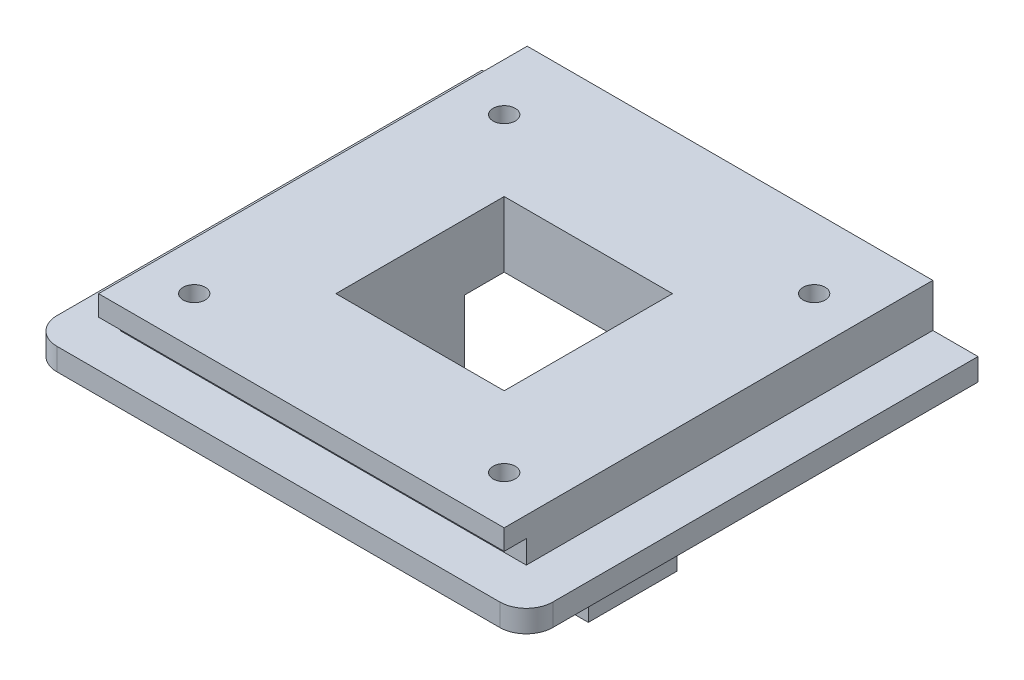
ISO-10303-21;
HEADER;
FILE_DESCRIPTION(('STEP AP214'),'2;1');
FILE_NAME('part.step','',(''),(''),'','','');
FILE_SCHEMA(('AUTOMOTIVE_DESIGN { 1 0 10303 214 1 1 1 1 }'));
ENDSEC;
DATA;
#1=APPLICATION_CONTEXT('core data for automotive mechanical design processes');
#2=APPLICATION_PROTOCOL_DEFINITION('international standard','automotive_design',2000,#1);
#3=PRODUCT_CONTEXT('',#1,'mechanical');
#4=PRODUCT('Part','Part','',(#3));
#5=PRODUCT_RELATED_PRODUCT_CATEGORY('part','',(#4));
#6=PRODUCT_DEFINITION_FORMATION('','',#4);
#7=PRODUCT_DEFINITION_CONTEXT('part definition',#1,'design');
#8=PRODUCT_DEFINITION('design','',#6,#7);
#9=PRODUCT_DEFINITION_SHAPE('','',#8);
#10=(LENGTH_UNIT() NAMED_UNIT(*) SI_UNIT(.MILLI.,.METRE.));
#11=(NAMED_UNIT(*) PLANE_ANGLE_UNIT() SI_UNIT($,.RADIAN.));
#12=(NAMED_UNIT(*) SI_UNIT($,.STERADIAN.) SOLID_ANGLE_UNIT());
#13=UNCERTAINTY_MEASURE_WITH_UNIT(LENGTH_MEASURE(1.E-05),#10,'distance_accuracy_value','');
#14=(GEOMETRIC_REPRESENTATION_CONTEXT(3) GLOBAL_UNCERTAINTY_ASSIGNED_CONTEXT((#13)) GLOBAL_UNIT_ASSIGNED_CONTEXT((#10,
#11,#12)) REPRESENTATION_CONTEXT('',''));
#15=CARTESIAN_POINT('',(0.,0.,0.));
#16=DIRECTION('',(0.,0.,1.));
#17=DIRECTION('',(1.,0.,0.));
#18=AXIS2_PLACEMENT_3D('',#15,#16,#17);
#19=CARTESIAN_POINT('',(32.5,-17.5,-15.5));
#20=DIRECTION('',(1.,0.,0.));
#21=DIRECTION('',(0.,0.,-1.));
#22=AXIS2_PLACEMENT_3D('',#19,#20,#21);
#23=PLANE('',#22);
#24=DIRECTION('',(0.,1.,0.));
#25=VECTOR('',#24,1.);
#26=CARTESIAN_POINT('',(32.5,-17.5,-15.5));
#27=LINE('',#26,#25);
#28=CARTESIAN_POINT('',(32.5,-17.5,-15.5));
#29=VERTEX_POINT('',#28);
#30=CARTESIAN_POINT('',(32.5,-2.5,-15.5));
#31=VERTEX_POINT('',#30);
#32=EDGE_CURVE('E320',#29,#31,#27,.T.);
#33=ORIENTED_EDGE('',*,*,#32,.T.);
#34=DIRECTION('',(0.,0.,1.));
#35=VECTOR('',#34,1.);
#36=CARTESIAN_POINT('',(32.5,-2.5,-11.));
#37=LINE('',#36,#35);
#38=CARTESIAN_POINT('',(32.5,-2.5,-11.));
#39=VERTEX_POINT('',#38);
#40=EDGE_CURVE('E499',#31,#39,#37,.T.);
#41=ORIENTED_EDGE('',*,*,#40,.T.);
#42=DIRECTION('',(0.,-1.,0.));
#43=VECTOR('',#42,1.);
#44=CARTESIAN_POINT('',(32.5,5.,-11.));
#45=LINE('',#44,#43);
#46=CARTESIAN_POINT('',(32.5,4.9,-11.));
#47=VERTEX_POINT('',#46);
#48=EDGE_CURVE('E254',#47,#39,#45,.T.);
#49=ORIENTED_EDGE('',*,*,#48,.F.);
#50=DIRECTION('',(0.,0.,1.));
#51=VECTOR('',#50,1.);
#52=CARTESIAN_POINT('',(32.5,4.9,-15.5));
#53=LINE('',#52,#51);
#54=CARTESIAN_POINT('',(32.5,4.9,-30.));
#55=VERTEX_POINT('',#54);
#56=EDGE_CURVE('E231',#55,#47,#53,.T.);
#57=ORIENTED_EDGE('',*,*,#56,.F.);
#58=DIRECTION('',(0.,-1.,0.));
#59=VECTOR('',#58,1.);
#60=CARTESIAN_POINT('',(32.5,5.,-30.));
#61=LINE('',#60,#59);
#62=CARTESIAN_POINT('',(32.5,-2.5,-30.));
#63=VERTEX_POINT('',#62);
#64=EDGE_CURVE('E247',#55,#63,#61,.T.);
#65=ORIENTED_EDGE('',*,*,#64,.T.);
#66=CARTESIAN_POINT('',(32.5,-2.5,-25.5));
#67=VERTEX_POINT('',#66);
#68=EDGE_CURVE('E496',#63,#67,#37,.T.);
#69=ORIENTED_EDGE('',*,*,#68,.T.);
#70=DIRECTION('',(0.,1.,0.));
#71=VECTOR('',#70,1.);
#72=CARTESIAN_POINT('',(32.5,-17.5,-25.5));
#73=LINE('',#72,#71);
#74=CARTESIAN_POINT('',(32.5,-17.5,-25.5));
#75=VERTEX_POINT('',#74);
#76=EDGE_CURVE('E316',#75,#67,#73,.T.);
#77=ORIENTED_EDGE('',*,*,#76,.F.);
#78=DIRECTION('',(0.,0.,-1.));
#79=VECTOR('',#78,1.);
#80=CARTESIAN_POINT('',(32.5,-17.5,-15.5));
#81=LINE('',#80,#79);
#82=EDGE_CURVE('E285',#29,#75,#81,.T.);
#83=ORIENTED_EDGE('',*,*,#82,.F.);
#84=EDGE_LOOP('',(#33,#41,#49,#57,#65,#69,#77,#83));
#85=FACE_BOUND('',#84,.T.);
#86=CARTESIAN_POINT('',(32.5,-10.5,-20.5));
#87=DIRECTION('',(1.,0.,0.));
#88=DIRECTION('',(0.,0.,-1.));
#89=AXIS2_PLACEMENT_3D('',#86,#87,#88);
#90=CIRCLE('',#89,1.55);
#91=CARTESIAN_POINT('',(32.5,-10.5,-22.05));
#92=VERTEX_POINT('',#91);
#93=EDGE_CURVE('E533',#92,#92,#90,.F.);
#94=ORIENTED_EDGE('',*,*,#93,.F.);
#95=EDGE_LOOP('',(#94));
#96=FACE_BOUND('',#95,.T.);
#97=ADVANCED_FACE('F45',(#85,#96),#23,.F.);
#98=CARTESIAN_POINT('',(13.5,-17.5,-15.5));
#99=DIRECTION('',(-1.,0.,0.));
#100=DIRECTION('',(0.,0.,1.));
#101=AXIS2_PLACEMENT_3D('',#98,#99,#100);
#102=PLANE('',#101);
#103=DIRECTION('',(0.,1.,0.));
#104=VECTOR('',#103,1.);
#105=CARTESIAN_POINT('',(13.5,-17.5,-25.5));
#106=LINE('',#105,#104);
#107=CARTESIAN_POINT('',(13.5,-17.5,-25.5));
#108=VERTEX_POINT('',#107);
#109=CARTESIAN_POINT('',(13.5,-2.5,-25.5));
#110=VERTEX_POINT('',#109);
#111=EDGE_CURVE('E360',#108,#110,#106,.T.);
#112=ORIENTED_EDGE('',*,*,#111,.T.);
#113=DIRECTION('',(0.,0.,-1.));
#114=VECTOR('',#113,1.);
#115=CARTESIAN_POINT('',(13.5,-2.5,-11.));
#116=LINE('',#115,#114);
#117=CARTESIAN_POINT('',(13.5,-2.5,-30.));
#118=VERTEX_POINT('',#117);
#119=EDGE_CURVE('E505',#110,#118,#116,.T.);
#120=ORIENTED_EDGE('',*,*,#119,.T.);
#121=DIRECTION('',(0.,-1.,0.));
#122=VECTOR('',#121,1.);
#123=CARTESIAN_POINT('',(13.5,5.,-30.));
#124=LINE('',#123,#122);
#125=CARTESIAN_POINT('',(13.5,4.9,-30.));
#126=VERTEX_POINT('',#125);
#127=EDGE_CURVE('E230',#126,#118,#124,.T.);
#128=ORIENTED_EDGE('',*,*,#127,.F.);
#129=DIRECTION('',(0.,0.,-1.));
#130=VECTOR('',#129,1.);
#131=CARTESIAN_POINT('',(13.5,4.9,-15.5));
#132=LINE('',#131,#130);
#133=CARTESIAN_POINT('',(13.5,4.9,-11.));
#134=VERTEX_POINT('',#133);
#135=EDGE_CURVE('E222',#134,#126,#132,.T.);
#136=ORIENTED_EDGE('',*,*,#135,.F.);
#137=DIRECTION('',(0.,-1.,0.));
#138=VECTOR('',#137,1.);
#139=CARTESIAN_POINT('',(13.5,5.,-11.));
#140=LINE('',#139,#138);
#141=CARTESIAN_POINT('',(13.5,-2.5,-11.));
#142=VERTEX_POINT('',#141);
#143=EDGE_CURVE('E259',#134,#142,#140,.T.);
#144=ORIENTED_EDGE('',*,*,#143,.T.);
#145=CARTESIAN_POINT('',(13.5,-2.5,-15.5));
#146=VERTEX_POINT('',#145);
#147=EDGE_CURVE('E502',#142,#146,#116,.T.);
#148=ORIENTED_EDGE('',*,*,#147,.T.);
#149=DIRECTION('',(0.,1.,0.));
#150=VECTOR('',#149,1.);
#151=CARTESIAN_POINT('',(13.5,-17.5,-15.5));
#152=LINE('',#151,#150);
#153=CARTESIAN_POINT('',(13.5,-17.5,-15.5));
#154=VERTEX_POINT('',#153);
#155=EDGE_CURVE('E356',#154,#146,#152,.T.);
#156=ORIENTED_EDGE('',*,*,#155,.F.);
#157=DIRECTION('',(0.,0.,1.));
#158=VECTOR('',#157,1.);
#159=CARTESIAN_POINT('',(13.5,-17.5,-15.5));
#160=LINE('',#159,#158);
#161=EDGE_CURVE('E334',#108,#154,#160,.T.);
#162=ORIENTED_EDGE('',*,*,#161,.F.);
#163=EDGE_LOOP('',(#112,#120,#128,#136,#144,#148,#156,#162));
#164=FACE_BOUND('',#163,.T.);
#165=CARTESIAN_POINT('',(13.5,-10.5,-20.5));
#166=DIRECTION('',(-1.,0.,0.));
#167=DIRECTION('',(0.,0.,1.));
#168=AXIS2_PLACEMENT_3D('',#165,#166,#167);
#169=CIRCLE('',#168,1.55);
#170=CARTESIAN_POINT('',(13.5,-10.5,-18.95));
#171=VERTEX_POINT('',#170);
#172=EDGE_CURVE('E264',#171,#171,#169,.F.);
#173=ORIENTED_EDGE('',*,*,#172,.F.);
#174=EDGE_LOOP('',(#173));
#175=FACE_BOUND('',#174,.T.);
#176=ADVANCED_FACE('F554',(#164,#175),#102,.F.);
#177=CARTESIAN_POINT('',(0.,-2.5,0.));
#178=DIRECTION('',(0.,-1.,0.));
#179=DIRECTION('',(0.,0.,-1.));
#180=AXIS2_PLACEMENT_3D('',#177,#178,#179);
#181=PLANE('',#180);
#182=CARTESIAN_POINT('',(5.5,-2.5,-38.));
#183=DIRECTION('',(0.,-1.,0.));
#184=DIRECTION('',(0.,0.,-1.));
#185=AXIS2_PLACEMENT_3D('',#182,#183,#184);
#186=CIRCLE('',#185,1.24999999999999);
#187=CARTESIAN_POINT('',(5.5,-2.5,-39.25));
#188=VERTEX_POINT('',#187);
#189=EDGE_CURVE('E205',#188,#188,#186,.T.);
#190=ORIENTED_EDGE('',*,*,#189,.F.);
#191=EDGE_LOOP('',(#190));
#192=FACE_BOUND('',#191,.T.);
#193=CARTESIAN_POINT('',(40.5,-2.5,-38.));
#194=DIRECTION('',(0.,-1.,0.));
#195=DIRECTION('',(0.,0.,-1.));
#196=AXIS2_PLACEMENT_3D('',#193,#194,#195);
#197=CIRCLE('',#196,1.24999999999999);
#198=CARTESIAN_POINT('',(40.5,-2.5,-39.25));
#199=VERTEX_POINT('',#198);
#200=EDGE_CURVE('E211',#199,#199,#197,.T.);
#201=ORIENTED_EDGE('',*,*,#200,.F.);
#202=EDGE_LOOP('',(#201));
#203=FACE_BOUND('',#202,.T.);
#204=CARTESIAN_POINT('',(40.5,-2.5,-3.));
#205=DIRECTION('',(0.,-1.,0.));
#206=DIRECTION('',(0.,0.,-1.));
#207=AXIS2_PLACEMENT_3D('',#204,#205,#206);
#208=CIRCLE('',#207,1.24999999999999);
#209=CARTESIAN_POINT('',(40.5,-2.5,-4.24999999999999));
#210=VERTEX_POINT('',#209);
#211=EDGE_CURVE('E216',#210,#210,#208,.T.);
#212=ORIENTED_EDGE('',*,*,#211,.F.);
#213=EDGE_LOOP('',(#212));
#214=FACE_BOUND('',#213,.T.);
#215=CARTESIAN_POINT('',(5.5,-2.5,-3.));
#216=DIRECTION('',(0.,-1.,0.));
#217=DIRECTION('',(0.,0.,-1.));
#218=AXIS2_PLACEMENT_3D('',#215,#216,#217);
#219=CIRCLE('',#218,1.24999999999999);
#220=CARTESIAN_POINT('',(5.5,-2.5,-4.24999999999999));
#221=VERTEX_POINT('',#220);
#222=EDGE_CURVE('E221',#221,#221,#219,.T.);
#223=ORIENTED_EDGE('',*,*,#222,.F.);
#224=EDGE_LOOP('',(#223));
#225=FACE_BOUND('',#224,.T.);
#226=ORIENTED_EDGE('',*,*,#147,.F.);
#227=DIRECTION('',(-1.,0.,0.));
#228=VECTOR('',#227,1.);
#229=CARTESIAN_POINT('',(13.5,-2.5,-11.));
#230=LINE('',#229,#228);
#231=EDGE_CURVE('E226',#39,#142,#230,.T.);
#232=ORIENTED_EDGE('',*,*,#231,.F.);
#233=ORIENTED_EDGE('',*,*,#40,.F.);
#234=DIRECTION('',(-1.,0.,0.));
#235=VECTOR('',#234,1.);
#236=CARTESIAN_POINT('',(37.5,-2.5,-15.5));
#237=LINE('',#236,#235);
#238=CARTESIAN_POINT('',(37.5,-2.5,-15.5));
#239=VERTEX_POINT('',#238);
#240=EDGE_CURVE('E268',#239,#31,#237,.T.);
#241=ORIENTED_EDGE('',*,*,#240,.F.);
#242=DIRECTION('',(0.,0.,1.));
#243=VECTOR('',#242,1.);
#244=CARTESIAN_POINT('',(37.5,-2.5,-15.5));
#245=LINE('',#244,#243);
#246=CARTESIAN_POINT('',(37.5,-2.5,-25.5));
#247=VERTEX_POINT('',#246);
#248=EDGE_CURVE('E286',#247,#239,#245,.T.);
#249=ORIENTED_EDGE('',*,*,#248,.F.);
#250=DIRECTION('',(1.,0.,0.));
#251=VECTOR('',#250,1.);
#252=CARTESIAN_POINT('',(37.5,-2.5,-25.5));
#253=LINE('',#252,#251);
#254=EDGE_CURVE('E302',#67,#247,#253,.T.);
#255=ORIENTED_EDGE('',*,*,#254,.F.);
#256=ORIENTED_EDGE('',*,*,#68,.F.);
#257=DIRECTION('',(1.,0.,0.));
#258=VECTOR('',#257,1.);
#259=CARTESIAN_POINT('',(13.5,-2.5,-30.));
#260=LINE('',#259,#258);
#261=EDGE_CURVE('E249',#118,#63,#260,.T.);
#262=ORIENTED_EDGE('',*,*,#261,.F.);
#263=ORIENTED_EDGE('',*,*,#119,.F.);
#264=DIRECTION('',(1.,0.,0.));
#265=VECTOR('',#264,1.);
#266=CARTESIAN_POINT('',(8.50000000000001,-2.5,-25.5));
#267=LINE('',#266,#265);
#268=CARTESIAN_POINT('',(8.50000000000001,-2.5,-25.5));
#269=VERTEX_POINT('',#268);
#270=EDGE_CURVE('E346',#269,#110,#267,.T.);
#271=ORIENTED_EDGE('',*,*,#270,.F.);
#272=DIRECTION('',(0.,0.,-1.));
#273=VECTOR('',#272,1.);
#274=CARTESIAN_POINT('',(8.5,-2.5,-15.5));
#275=LINE('',#274,#273);
#276=CARTESIAN_POINT('',(8.5,-2.5,-15.5));
#277=VERTEX_POINT('',#276);
#278=EDGE_CURVE('E324',#277,#269,#275,.T.);
#279=ORIENTED_EDGE('',*,*,#278,.F.);
#280=DIRECTION('',(-1.,0.,0.));
#281=VECTOR('',#280,1.);
#282=CARTESIAN_POINT('',(8.5,-2.5,-15.5));
#283=LINE('',#282,#281);
#284=EDGE_CURVE('E330',#146,#277,#283,.T.);
#285=ORIENTED_EDGE('',*,*,#284,.F.);
#286=EDGE_LOOP('',(#226,#232,#233,#241,#249,#255,#256,#262,#263,#271,#279,#285));
#287=FACE_BOUND('',#286,.T.);
#288=DIRECTION('',(0.,0.,1.));
#289=VECTOR('',#288,1.);
#290=CARTESIAN_POINT('',(51.,-2.5,5.));
#291=LINE('',#290,#289);
#292=CARTESIAN_POINT('',(51.,-2.5,-46.));
#293=VERTEX_POINT('',#292);
#294=CARTESIAN_POINT('',(51.,-2.5,2.));
#295=VERTEX_POINT('',#294);
#296=EDGE_CURVE('E369',#293,#295,#291,.T.);
#297=ORIENTED_EDGE('',*,*,#296,.T.);
#298=CARTESIAN_POINT('',(48.,-2.5,2.));
#299=DIRECTION('',(0.,-1.,0.));
#300=DIRECTION('',(0.,0.,-1.));
#301=AXIS2_PLACEMENT_3D('',#298,#299,#300);
#302=CIRCLE('',#301,3.);
#303=CARTESIAN_POINT('',(48.,-2.5,5.));
#304=VERTEX_POINT('',#303);
#305=EDGE_CURVE('E56',#295,#304,#302,.T.);
#306=ORIENTED_EDGE('',*,*,#305,.T.);
#307=DIRECTION('',(-1.,0.,0.));
#308=VECTOR('',#307,1.);
#309=CARTESIAN_POINT('',(-5.,-2.5,5.));
#310=LINE('',#309,#308);
#311=CARTESIAN_POINT('',(-2.,-2.5,5.));
#312=VERTEX_POINT('',#311);
#313=EDGE_CURVE('E373',#304,#312,#310,.T.);
#314=ORIENTED_EDGE('',*,*,#313,.T.);
#315=CARTESIAN_POINT('',(-2.,-2.5,2.));
#316=DIRECTION('',(0.,-1.,0.));
#317=DIRECTION('',(0.,0.,-1.));
#318=AXIS2_PLACEMENT_3D('',#315,#316,#317);
#319=CIRCLE('',#318,3.);
#320=CARTESIAN_POINT('',(-5.,-2.5,2.));
#321=VERTEX_POINT('',#320);
#322=EDGE_CURVE('E65',#312,#321,#319,.T.);
#323=ORIENTED_EDGE('',*,*,#322,.T.);
#324=DIRECTION('',(0.,0.,-1.));
#325=VECTOR('',#324,1.);
#326=CARTESIAN_POINT('',(-5.,-2.5,5.));
#327=LINE('',#326,#325);
#328=CARTESIAN_POINT('',(-4.99999999999999,-2.5,-46.));
#329=VERTEX_POINT('',#328);
#330=EDGE_CURVE('E377',#321,#329,#327,.T.);
#331=ORIENTED_EDGE('',*,*,#330,.T.);
#332=DIRECTION('',(1.,0.,0.));
#333=VECTOR('',#332,1.);
#334=CARTESIAN_POINT('',(-4.99999999999999,-2.5,-46.));
#335=LINE('',#334,#333);
#336=EDGE_CURVE('E380',#329,#293,#335,.T.);
#337=ORIENTED_EDGE('',*,*,#336,.T.);
#338=EDGE_LOOP('',(#297,#306,#314,#323,#331,#337));
#339=FACE_BOUND('',#338,.T.);
#340=ADVANCED_FACE('F430',(#192,#203,#214,#225,#287,#339),#181,.T.);
#341=CARTESIAN_POINT('',(0.1,2.5,0.));
#342=DIRECTION('',(1.,0.,0.));
#343=DIRECTION('',(0.,0.,-1.));
#344=AXIS2_PLACEMENT_3D('',#341,#342,#343);
#345=PLANE('',#344);
#346=DIRECTION('',(0.,0.,1.));
#347=VECTOR('',#346,1.);
#348=CARTESIAN_POINT('',(0.1,0.,0.));
#349=LINE('',#348,#347);
#350=CARTESIAN_POINT('',(0.1,0.,-46.));
#351=VERTEX_POINT('',#350);
#352=CARTESIAN_POINT('',(0.1,0.,-0.1));
#353=VERTEX_POINT('',#352);
#354=EDGE_CURVE('E161',#351,#353,#349,.T.);
#355=ORIENTED_EDGE('',*,*,#354,.T.);
#356=DIRECTION('',(0.,-1.,0.));
#357=VECTOR('',#356,1.);
#358=CARTESIAN_POINT('',(0.1,2.5,-0.1));
#359=LINE('',#358,#357);
#360=CARTESIAN_POINT('',(0.1,2.6,-0.1));
#361=VERTEX_POINT('',#360);
#362=EDGE_CURVE('E180',#361,#353,#359,.T.);
#363=ORIENTED_EDGE('',*,*,#362,.F.);
#364=DIRECTION('',(0.,0.,1.));
#365=VECTOR('',#364,1.);
#366=CARTESIAN_POINT('',(0.1,2.6,0.));
#367=LINE('',#366,#365);
#368=CARTESIAN_POINT('',(0.1,2.6,2.4));
#369=VERTEX_POINT('',#368);
#370=EDGE_CURVE('E175',#361,#369,#367,.T.);
#371=ORIENTED_EDGE('',*,*,#370,.T.);
#372=DIRECTION('',(0.,-1.,0.));
#373=VECTOR('',#372,1.);
#374=CARTESIAN_POINT('',(0.1,5.,2.4));
#375=LINE('',#374,#373);
#376=CARTESIAN_POINT('',(0.1,4.9,2.4));
#377=VERTEX_POINT('',#376);
#378=EDGE_CURVE('E151',#377,#369,#375,.T.);
#379=ORIENTED_EDGE('',*,*,#378,.F.);
#380=DIRECTION('',(0.,0.,1.));
#381=VECTOR('',#380,1.);
#382=CARTESIAN_POINT('',(0.1,4.9,0.));
#383=LINE('',#382,#381);
#384=CARTESIAN_POINT('',(0.1,4.9,-46.));
#385=VERTEX_POINT('',#384);
#386=EDGE_CURVE('E168',#385,#377,#383,.T.);
#387=ORIENTED_EDGE('',*,*,#386,.F.);
#388=DIRECTION('',(0.,-1.,0.));
#389=VECTOR('',#388,1.);
#390=CARTESIAN_POINT('',(0.1,2.5,-46.));
#391=LINE('',#390,#389);
#392=EDGE_CURVE('E134',#385,#351,#391,.T.);
#393=ORIENTED_EDGE('',*,*,#392,.T.);
#394=EDGE_LOOP('',(#355,#363,#371,#379,#387,#393));
#395=FACE_BOUND('',#394,.T.);
#396=ADVANCED_FACE('F477',(#395),#345,.F.);
#397=CARTESIAN_POINT('',(0.,2.5,-0.1));
#398=DIRECTION('',(0.,0.,-1.));
#399=DIRECTION('',(-1.,0.,0.));
#400=AXIS2_PLACEMENT_3D('',#397,#398,#399);
#401=PLANE('',#400);
#402=DIRECTION('',(1.,0.,0.));
#403=VECTOR('',#402,1.);
#404=CARTESIAN_POINT('',(0.,0.,-0.1));
#405=LINE('',#404,#403);
#406=CARTESIAN_POINT('',(45.9,0.,-0.1));
#407=VERTEX_POINT('',#406);
#408=EDGE_CURVE('E157',#353,#407,#405,.T.);
#409=ORIENTED_EDGE('',*,*,#408,.T.);
#410=DIRECTION('',(0.,-1.,0.));
#411=VECTOR('',#410,1.);
#412=CARTESIAN_POINT('',(45.9,2.5,-0.1));
#413=LINE('',#412,#411);
#414=CARTESIAN_POINT('',(45.9,2.6,-0.1));
#415=VERTEX_POINT('',#414);
#416=EDGE_CURVE('E133',#415,#407,#413,.T.);
#417=ORIENTED_EDGE('',*,*,#416,.F.);
#418=DIRECTION('',(1.,0.,0.));
#419=VECTOR('',#418,1.);
#420=CARTESIAN_POINT('',(0.,2.6,-0.1));
#421=LINE('',#420,#419);
#422=EDGE_CURVE('E167',#361,#415,#421,.T.);
#423=ORIENTED_EDGE('',*,*,#422,.F.);
#424=ORIENTED_EDGE('',*,*,#362,.T.);
#425=EDGE_LOOP('',(#409,#417,#423,#424));
#426=FACE_BOUND('',#425,.T.);
#427=ADVANCED_FACE('F486',(#426),#401,.F.);
#428=CARTESIAN_POINT('',(45.9,2.5,0.));
#429=DIRECTION('',(-1.,0.,0.));
#430=DIRECTION('',(0.,0.,1.));
#431=AXIS2_PLACEMENT_3D('',#428,#429,#430);
#432=PLANE('',#431);
#433=DIRECTION('',(0.,0.,-1.));
#434=VECTOR('',#433,1.);
#435=CARTESIAN_POINT('',(45.9,0.,0.));
#436=LINE('',#435,#434);
#437=CARTESIAN_POINT('',(45.9,0.,-46.));
#438=VERTEX_POINT('',#437);
#439=EDGE_CURVE('E128',#407,#438,#436,.T.);
#440=ORIENTED_EDGE('',*,*,#439,.T.);
#441=DIRECTION('',(0.,-1.,0.));
#442=VECTOR('',#441,1.);
#443=CARTESIAN_POINT('',(45.9,2.5,-46.));
#444=LINE('',#443,#442);
#445=CARTESIAN_POINT('',(45.9,4.9,-46.));
#446=VERTEX_POINT('',#445);
#447=EDGE_CURVE('E49',#446,#438,#444,.T.);
#448=ORIENTED_EDGE('',*,*,#447,.F.);
#449=DIRECTION('',(0.,0.,-1.));
#450=VECTOR('',#449,1.);
#451=CARTESIAN_POINT('',(45.9,4.9,0.));
#452=LINE('',#451,#450);
#453=CARTESIAN_POINT('',(45.9,4.9,2.4));
#454=VERTEX_POINT('',#453);
#455=EDGE_CURVE('E126',#454,#446,#452,.T.);
#456=ORIENTED_EDGE('',*,*,#455,.F.);
#457=DIRECTION('',(0.,-1.,0.));
#458=VECTOR('',#457,1.);
#459=CARTESIAN_POINT('',(45.9,2.5,2.4));
#460=LINE('',#459,#458);
#461=CARTESIAN_POINT('',(45.9,2.6,2.4));
#462=VERTEX_POINT('',#461);
#463=EDGE_CURVE('E148',#454,#462,#460,.T.);
#464=ORIENTED_EDGE('',*,*,#463,.T.);
#465=DIRECTION('',(0.,0.,-1.));
#466=VECTOR('',#465,1.);
#467=CARTESIAN_POINT('',(45.9,2.6,0.));
#468=LINE('',#467,#466);
#469=EDGE_CURVE('E171',#462,#415,#468,.T.);
#470=ORIENTED_EDGE('',*,*,#469,.T.);
#471=ORIENTED_EDGE('',*,*,#416,.T.);
#472=EDGE_LOOP('',(#440,#448,#456,#464,#470,#471));
#473=FACE_BOUND('',#472,.T.);
#474=ADVANCED_FACE('F47',(#473),#432,.F.);
#475=CARTESIAN_POINT('',(0.,2.5,-46.));
#476=DIRECTION('',(0.,0.,1.));
#477=DIRECTION('',(1.,0.,0.));
#478=AXIS2_PLACEMENT_3D('',#475,#476,#477);
#479=PLANE('',#478);
#480=CARTESIAN_POINT('',(36.,1.9,-46.));
#481=DIRECTION('',(0.,0.,-1.));
#482=DIRECTION('',(-1.,0.,0.));
#483=AXIS2_PLACEMENT_3D('',#480,#481,#482);
#484=CIRCLE('',#483,1.02499999999999);
#485=CARTESIAN_POINT('',(34.975,1.9,-46.));
#486=VERTEX_POINT('',#485);
#487=EDGE_CURVE('E529',#486,#486,#484,.T.);
#488=ORIENTED_EDGE('',*,*,#487,.F.);
#489=EDGE_LOOP('',(#488));
#490=FACE_BOUND('',#489,.T.);
#491=CARTESIAN_POINT('',(10.,1.9,-46.));
#492=DIRECTION('',(0.,0.,-1.));
#493=DIRECTION('',(-1.,0.,0.));
#494=AXIS2_PLACEMENT_3D('',#491,#492,#493);
#495=CIRCLE('',#494,1.02499999999999);
#496=CARTESIAN_POINT('',(8.97500000000002,1.9,-46.));
#497=VERTEX_POINT('',#496);
#498=EDGE_CURVE('E521',#497,#497,#495,.T.);
#499=ORIENTED_EDGE('',*,*,#498,.F.);
#500=EDGE_LOOP('',(#499));
#501=FACE_BOUND('',#500,.T.);
#502=ORIENTED_EDGE('',*,*,#447,.T.);
#503=DIRECTION('',(1.,0.,0.));
#504=VECTOR('',#503,1.);
#505=CARTESIAN_POINT('',(-4.99999999999999,0.,-46.));
#506=LINE('',#505,#504);
#507=CARTESIAN_POINT('',(51.,0.,-46.));
#508=VERTEX_POINT('',#507);
#509=EDGE_CURVE('E396',#438,#508,#506,.T.);
#510=ORIENTED_EDGE('',*,*,#509,.T.);
#511=DIRECTION('',(0.,1.,0.));
#512=VECTOR('',#511,1.);
#513=CARTESIAN_POINT('',(51.,-2.5,-46.));
#514=LINE('',#513,#512);
#515=EDGE_CURVE('E384',#293,#508,#514,.T.);
#516=ORIENTED_EDGE('',*,*,#515,.F.);
#517=ORIENTED_EDGE('',*,*,#336,.F.);
#518=DIRECTION('',(0.,1.,0.));
#519=VECTOR('',#518,1.);
#520=CARTESIAN_POINT('',(-4.99999999999999,-2.5,-46.));
#521=LINE('',#520,#519);
#522=CARTESIAN_POINT('',(-4.99999999999999,0.,-46.));
#523=VERTEX_POINT('',#522);
#524=EDGE_CURVE('E179',#329,#523,#521,.T.);
#525=ORIENTED_EDGE('',*,*,#524,.T.);
#526=EDGE_CURVE('E374',#523,#351,#506,.T.);
#527=ORIENTED_EDGE('',*,*,#526,.T.);
#528=ORIENTED_EDGE('',*,*,#392,.F.);
#529=DIRECTION('',(-1.,0.,0.));
#530=VECTOR('',#529,1.);
#531=CARTESIAN_POINT('',(0.,4.9,-46.));
#532=LINE('',#531,#530);
#533=EDGE_CURVE('E139',#446,#385,#532,.T.);
#534=ORIENTED_EDGE('',*,*,#533,.F.);
#535=EDGE_LOOP('',(#502,#510,#516,#517,#525,#527,#528,#534));
#536=FACE_BOUND('',#535,.T.);
#537=ADVANCED_FACE('F144',(#490,#501,#536),#479,.F.);
#538=CARTESIAN_POINT('',(0.,2.6,0.));
#539=DIRECTION('',(0.,1.,0.));
#540=DIRECTION('',(0.,0.,1.));
#541=AXIS2_PLACEMENT_3D('',#538,#539,#540);
#542=PLANE('',#541);
#543=ORIENTED_EDGE('',*,*,#370,.F.);
#544=ORIENTED_EDGE('',*,*,#422,.T.);
#545=ORIENTED_EDGE('',*,*,#469,.F.);
#546=DIRECTION('',(1.,0.,0.));
#547=VECTOR('',#546,1.);
#548=CARTESIAN_POINT('',(0.,2.6,2.4));
#549=LINE('',#548,#547);
#550=EDGE_CURVE('E178',#369,#462,#549,.T.);
#551=ORIENTED_EDGE('',*,*,#550,.F.);
#552=EDGE_LOOP('',(#543,#544,#545,#551));
#553=FACE_BOUND('',#552,.T.);
#554=ADVANCED_FACE('F484',(#553),#542,.F.);
#555=CARTESIAN_POINT('',(0.,5.,2.4));
#556=DIRECTION('',(0.,0.,-1.));
#557=DIRECTION('',(-1.,0.,0.));
#558=AXIS2_PLACEMENT_3D('',#555,#556,#557);
#559=PLANE('',#558);
#560=ORIENTED_EDGE('',*,*,#550,.T.);
#561=ORIENTED_EDGE('',*,*,#463,.F.);
#562=DIRECTION('',(1.,0.,0.));
#563=VECTOR('',#562,1.);
#564=CARTESIAN_POINT('',(0.,4.9,2.4));
#565=LINE('',#564,#563);
#566=EDGE_CURVE('E141',#377,#454,#565,.T.);
#567=ORIENTED_EDGE('',*,*,#566,.F.);
#568=ORIENTED_EDGE('',*,*,#378,.T.);
#569=EDGE_LOOP('',(#560,#561,#567,#568));
#570=FACE_BOUND('',#569,.T.);
#571=ADVANCED_FACE('F481',(#570),#559,.F.);
#572=CARTESIAN_POINT('',(0.,4.9,0.));
#573=DIRECTION('',(0.,1.,0.));
#574=DIRECTION('',(0.,0.,1.));
#575=AXIS2_PLACEMENT_3D('',#572,#573,#574);
#576=PLANE('',#575);
#577=CARTESIAN_POINT('',(5.5,4.9,-38.));
#578=DIRECTION('',(0.,1.,0.));
#579=DIRECTION('',(0.,0.,1.));
#580=AXIS2_PLACEMENT_3D('',#577,#578,#579);
#581=CIRCLE('',#580,1.24999999999999);
#582=CARTESIAN_POINT('',(5.5,4.9,-36.75));
#583=VERTEX_POINT('',#582);
#584=EDGE_CURVE('E201',#583,#583,#581,.T.);
#585=ORIENTED_EDGE('',*,*,#584,.F.);
#586=EDGE_LOOP('',(#585));
#587=FACE_BOUND('',#586,.T.);
#588=CARTESIAN_POINT('',(40.5,4.9,-38.));
#589=DIRECTION('',(0.,1.,0.));
#590=DIRECTION('',(0.,0.,1.));
#591=AXIS2_PLACEMENT_3D('',#588,#589,#590);
#592=CIRCLE('',#591,1.24999999999999);
#593=CARTESIAN_POINT('',(40.5,4.9,-36.75));
#594=VERTEX_POINT('',#593);
#595=EDGE_CURVE('E207',#594,#594,#592,.T.);
#596=ORIENTED_EDGE('',*,*,#595,.F.);
#597=EDGE_LOOP('',(#596));
#598=FACE_BOUND('',#597,.T.);
#599=CARTESIAN_POINT('',(40.5,4.9,-3.));
#600=DIRECTION('',(0.,1.,0.));
#601=DIRECTION('',(0.,0.,1.));
#602=AXIS2_PLACEMENT_3D('',#599,#600,#601);
#603=CIRCLE('',#602,1.24999999999999);
#604=CARTESIAN_POINT('',(40.5,4.9,-1.75000000000001));
#605=VERTEX_POINT('',#604);
#606=EDGE_CURVE('E212',#605,#605,#603,.T.);
#607=ORIENTED_EDGE('',*,*,#606,.F.);
#608=EDGE_LOOP('',(#607));
#609=FACE_BOUND('',#608,.T.);
#610=CARTESIAN_POINT('',(5.5,4.9,-3.));
#611=DIRECTION('',(0.,1.,0.));
#612=DIRECTION('',(0.,0.,1.));
#613=AXIS2_PLACEMENT_3D('',#610,#611,#612);
#614=CIRCLE('',#613,1.24999999999999);
#615=CARTESIAN_POINT('',(5.5,4.9,-1.75));
#616=VERTEX_POINT('',#615);
#617=EDGE_CURVE('E217',#616,#616,#614,.T.);
#618=ORIENTED_EDGE('',*,*,#617,.F.);
#619=EDGE_LOOP('',(#618));
#620=FACE_BOUND('',#619,.T.);
#621=ORIENTED_EDGE('',*,*,#135,.T.);
#622=DIRECTION('',(1.,0.,0.));
#623=VECTOR('',#622,1.);
#624=CARTESIAN_POINT('',(13.5,4.9,-30.));
#625=LINE('',#624,#623);
#626=EDGE_CURVE('E155',#126,#55,#625,.T.);
#627=ORIENTED_EDGE('',*,*,#626,.T.);
#628=ORIENTED_EDGE('',*,*,#56,.T.);
#629=DIRECTION('',(-1.,0.,0.));
#630=VECTOR('',#629,1.);
#631=CARTESIAN_POINT('',(13.5,4.9,-11.));
#632=LINE('',#631,#630);
#633=EDGE_CURVE('E227',#47,#134,#632,.T.);
#634=ORIENTED_EDGE('',*,*,#633,.T.);
#635=EDGE_LOOP('',(#621,#627,#628,#634));
#636=FACE_BOUND('',#635,.T.);
#637=ORIENTED_EDGE('',*,*,#386,.T.);
#638=ORIENTED_EDGE('',*,*,#566,.T.);
#639=ORIENTED_EDGE('',*,*,#455,.T.);
#640=ORIENTED_EDGE('',*,*,#533,.T.);
#641=EDGE_LOOP('',(#637,#638,#639,#640));
#642=FACE_BOUND('',#641,.T.);
#643=ADVANCED_FACE('F138',(#587,#598,#609,#620,#636,#642),#576,.T.);
#644=CARTESIAN_POINT('',(51.,-2.5,5.));
#645=DIRECTION('',(-1.,0.,0.));
#646=DIRECTION('',(0.,0.,1.));
#647=AXIS2_PLACEMENT_3D('',#644,#645,#646);
#648=PLANE('',#647);
#649=DIRECTION('',(0.,0.,1.));
#650=VECTOR('',#649,1.);
#651=CARTESIAN_POINT('',(51.,0.,5.));
#652=LINE('',#651,#650);
#653=CARTESIAN_POINT('',(51.,0.,2.));
#654=VERTEX_POINT('',#653);
#655=EDGE_CURVE('E368',#508,#654,#652,.T.);
#656=ORIENTED_EDGE('',*,*,#655,.T.);
#657=DIRECTION('',(0.,1.,0.));
#658=VECTOR('',#657,1.);
#659=CARTESIAN_POINT('',(51.,-2.5,2.));
#660=LINE('',#659,#658);
#661=EDGE_CURVE('E420',#654,#295,#660,.F.);
#662=ORIENTED_EDGE('',*,*,#661,.T.);
#663=ORIENTED_EDGE('',*,*,#296,.F.);
#664=ORIENTED_EDGE('',*,*,#515,.T.);
#665=EDGE_LOOP('',(#656,#662,#663,#664));
#666=FACE_BOUND('',#665,.T.);
#667=ADVANCED_FACE('F452',(#666),#648,.F.);
#668=CARTESIAN_POINT('',(-5.,-2.5,5.));
#669=DIRECTION('',(0.,0.,-1.));
#670=DIRECTION('',(-1.,0.,0.));
#671=AXIS2_PLACEMENT_3D('',#668,#669,#670);
#672=PLANE('',#671);
#673=ORIENTED_EDGE('',*,*,#313,.F.);
#674=DIRECTION('',(0.,1.,0.));
#675=VECTOR('',#674,1.);
#676=CARTESIAN_POINT('',(48.,-2.5,5.));
#677=LINE('',#676,#675);
#678=CARTESIAN_POINT('',(48.,0.,5.));
#679=VERTEX_POINT('',#678);
#680=EDGE_CURVE('E408',#304,#679,#677,.T.);
#681=ORIENTED_EDGE('',*,*,#680,.T.);
#682=DIRECTION('',(-1.,0.,0.));
#683=VECTOR('',#682,1.);
#684=CARTESIAN_POINT('',(-5.,0.,5.));
#685=LINE('',#684,#683);
#686=CARTESIAN_POINT('',(-2.,0.,5.));
#687=VERTEX_POINT('',#686);
#688=EDGE_CURVE('E388',#679,#687,#685,.T.);
#689=ORIENTED_EDGE('',*,*,#688,.T.);
#690=DIRECTION('',(0.,1.,0.));
#691=VECTOR('',#690,1.);
#692=CARTESIAN_POINT('',(-2.,-2.5,5.));
#693=LINE('',#692,#691);
#694=EDGE_CURVE('E184',#687,#312,#693,.F.);
#695=ORIENTED_EDGE('',*,*,#694,.T.);
#696=EDGE_LOOP('',(#673,#681,#689,#695));
#697=FACE_BOUND('',#696,.T.);
#698=ADVANCED_FACE('F439',(#697),#672,.F.);
#699=CARTESIAN_POINT('',(-5.,-2.5,5.));
#700=DIRECTION('',(1.,0.,0.));
#701=DIRECTION('',(0.,0.,-1.));
#702=AXIS2_PLACEMENT_3D('',#699,#700,#701);
#703=PLANE('',#702);
#704=ORIENTED_EDGE('',*,*,#330,.F.);
#705=DIRECTION('',(0.,1.,0.));
#706=VECTOR('',#705,1.);
#707=CARTESIAN_POINT('',(-5.,-2.5,2.));
#708=LINE('',#707,#706);
#709=CARTESIAN_POINT('',(-5.,0.,2.));
#710=VERTEX_POINT('',#709);
#711=EDGE_CURVE('E12',#321,#710,#708,.T.);
#712=ORIENTED_EDGE('',*,*,#711,.T.);
#713=DIRECTION('',(0.,0.,-1.));
#714=VECTOR('',#713,1.);
#715=CARTESIAN_POINT('',(-5.,0.,5.));
#716=LINE('',#715,#714);
#717=EDGE_CURVE('E392',#710,#523,#716,.T.);
#718=ORIENTED_EDGE('',*,*,#717,.T.);
#719=ORIENTED_EDGE('',*,*,#524,.F.);
#720=EDGE_LOOP('',(#704,#712,#718,#719));
#721=FACE_BOUND('',#720,.T.);
#722=ADVANCED_FACE('F473',(#721),#703,.F.);
#723=CARTESIAN_POINT('',(0.,0.,0.));
#724=DIRECTION('',(0.,-1.,0.));
#725=DIRECTION('',(0.,0.,-1.));
#726=AXIS2_PLACEMENT_3D('',#723,#724,#725);
#727=PLANE('',#726);
#728=ORIENTED_EDGE('',*,*,#688,.F.);
#729=CARTESIAN_POINT('',(48.,0.,2.));
#730=DIRECTION('',(0.,-1.,0.));
#731=DIRECTION('',(0.,0.,-1.));
#732=AXIS2_PLACEMENT_3D('',#729,#730,#731);
#733=CIRCLE('',#732,3.);
#734=EDGE_CURVE('E416',#679,#654,#733,.F.);
#735=ORIENTED_EDGE('',*,*,#734,.T.);
#736=ORIENTED_EDGE('',*,*,#655,.F.);
#737=ORIENTED_EDGE('',*,*,#509,.F.);
#738=ORIENTED_EDGE('',*,*,#439,.F.);
#739=ORIENTED_EDGE('',*,*,#408,.F.);
#740=ORIENTED_EDGE('',*,*,#354,.F.);
#741=ORIENTED_EDGE('',*,*,#526,.F.);
#742=ORIENTED_EDGE('',*,*,#717,.F.);
#743=CARTESIAN_POINT('',(-2.,0.,2.));
#744=DIRECTION('',(0.,-1.,0.));
#745=DIRECTION('',(0.,0.,-1.));
#746=AXIS2_PLACEMENT_3D('',#743,#744,#745);
#747=CIRCLE('',#746,3.);
#748=EDGE_CURVE('E412',#710,#687,#747,.F.);
#749=ORIENTED_EDGE('',*,*,#748,.T.);
#750=EDGE_LOOP('',(#728,#735,#736,#737,#738,#739,#740,#741,#742,#749));
#751=FACE_BOUND('',#750,.T.);
#752=ADVANCED_FACE('F447',(#751),#727,.F.);
#753=CARTESIAN_POINT('',(8.5,-17.5,-15.5));
#754=DIRECTION('',(1.,0.,0.));
#755=DIRECTION('',(0.,0.,-1.));
#756=AXIS2_PLACEMENT_3D('',#753,#754,#755);
#757=PLANE('',#756);
#758=CARTESIAN_POINT('',(8.5,-10.5,-20.5));
#759=DIRECTION('',(-1.,0.,0.));
#760=DIRECTION('',(0.,0.,1.));
#761=AXIS2_PLACEMENT_3D('',#758,#759,#760);
#762=CIRCLE('',#761,2.75);
#763=CARTESIAN_POINT('',(8.5,-10.5,-17.75));
#764=VERTEX_POINT('',#763);
#765=EDGE_CURVE('E270',#764,#764,#762,.T.);
#766=ORIENTED_EDGE('',*,*,#765,.F.);
#767=EDGE_LOOP('',(#766));
#768=FACE_BOUND('',#767,.T.);
#769=ORIENTED_EDGE('',*,*,#278,.T.);
#770=DIRECTION('',(0.,1.,0.));
#771=VECTOR('',#770,1.);
#772=CARTESIAN_POINT('',(8.50000000000001,-17.5,-25.5));
#773=LINE('',#772,#771);
#774=CARTESIAN_POINT('',(8.50000000000001,-17.5,-25.5));
#775=VERTEX_POINT('',#774);
#776=EDGE_CURVE('E364',#775,#269,#773,.T.);
#777=ORIENTED_EDGE('',*,*,#776,.F.);
#778=DIRECTION('',(0.,0.,-1.));
#779=VECTOR('',#778,1.);
#780=CARTESIAN_POINT('',(8.5,-17.5,-15.5));
#781=LINE('',#780,#779);
#782=CARTESIAN_POINT('',(8.5,-17.5,-15.5));
#783=VERTEX_POINT('',#782);
#784=EDGE_CURVE('E325',#783,#775,#781,.T.);
#785=ORIENTED_EDGE('',*,*,#784,.F.);
#786=DIRECTION('',(0.,1.,0.));
#787=VECTOR('',#786,1.);
#788=CARTESIAN_POINT('',(8.5,-17.5,-15.5));
#789=LINE('',#788,#787);
#790=EDGE_CURVE('E342',#783,#277,#789,.T.);
#791=ORIENTED_EDGE('',*,*,#790,.T.);
#792=EDGE_LOOP('',(#769,#777,#785,#791));
#793=FACE_BOUND('',#792,.T.);
#794=ADVANCED_FACE('F579',(#768,#793),#757,.F.);
#795=CARTESIAN_POINT('',(8.50000000000001,-17.5,-25.5));
#796=DIRECTION('',(0.,0.,1.));
#797=DIRECTION('',(1.,0.,0.));
#798=AXIS2_PLACEMENT_3D('',#795,#796,#797);
#799=PLANE('',#798);
#800=ORIENTED_EDGE('',*,*,#270,.T.);
#801=ORIENTED_EDGE('',*,*,#111,.F.);
#802=DIRECTION('',(1.,0.,0.));
#803=VECTOR('',#802,1.);
#804=CARTESIAN_POINT('',(8.50000000000001,-17.5,-25.5));
#805=LINE('',#804,#803);
#806=EDGE_CURVE('E329',#775,#108,#805,.T.);
#807=ORIENTED_EDGE('',*,*,#806,.F.);
#808=ORIENTED_EDGE('',*,*,#776,.T.);
#809=EDGE_LOOP('',(#800,#801,#807,#808));
#810=FACE_BOUND('',#809,.T.);
#811=ADVANCED_FACE('F574',(#810),#799,.F.);
#812=CARTESIAN_POINT('',(8.5,-17.5,-15.5));
#813=DIRECTION('',(0.,0.,-1.));
#814=DIRECTION('',(-1.,0.,0.));
#815=AXIS2_PLACEMENT_3D('',#812,#813,#814);
#816=PLANE('',#815);
#817=ORIENTED_EDGE('',*,*,#284,.T.);
#818=ORIENTED_EDGE('',*,*,#790,.F.);
#819=DIRECTION('',(-1.,0.,0.));
#820=VECTOR('',#819,1.);
#821=CARTESIAN_POINT('',(8.5,-17.5,-15.5));
#822=LINE('',#821,#820);
#823=EDGE_CURVE('E338',#154,#783,#822,.T.);
#824=ORIENTED_EDGE('',*,*,#823,.F.);
#825=ORIENTED_EDGE('',*,*,#155,.T.);
#826=EDGE_LOOP('',(#817,#818,#824,#825));
#827=FACE_BOUND('',#826,.T.);
#828=ADVANCED_FACE('F571',(#827),#816,.F.);
#829=CARTESIAN_POINT('',(0.,-17.5,0.));
#830=DIRECTION('',(0.,-1.,0.));
#831=DIRECTION('',(0.,0.,-1.));
#832=AXIS2_PLACEMENT_3D('',#829,#830,#831);
#833=PLANE('',#832);
#834=ORIENTED_EDGE('',*,*,#784,.T.);
#835=ORIENTED_EDGE('',*,*,#806,.T.);
#836=ORIENTED_EDGE('',*,*,#161,.T.);
#837=ORIENTED_EDGE('',*,*,#823,.T.);
#838=EDGE_LOOP('',(#834,#835,#836,#837));
#839=FACE_BOUND('',#838,.T.);
#840=ADVANCED_FACE('F567',(#839),#833,.T.);
#841=CARTESIAN_POINT('',(37.5,-17.5,-15.5));
#842=DIRECTION('',(0.,0.,-1.));
#843=DIRECTION('',(-1.,0.,0.));
#844=AXIS2_PLACEMENT_3D('',#841,#842,#843);
#845=PLANE('',#844);
#846=ORIENTED_EDGE('',*,*,#240,.T.);
#847=ORIENTED_EDGE('',*,*,#32,.F.);
#848=DIRECTION('',(-1.,0.,0.));
#849=VECTOR('',#848,1.);
#850=CARTESIAN_POINT('',(37.5,-17.5,-15.5));
#851=LINE('',#850,#849);
#852=CARTESIAN_POINT('',(37.5,-17.5,-15.5));
#853=VERTEX_POINT('',#852);
#854=EDGE_CURVE('E281',#853,#29,#851,.T.);
#855=ORIENTED_EDGE('',*,*,#854,.F.);
#856=DIRECTION('',(0.,1.,0.));
#857=VECTOR('',#856,1.);
#858=CARTESIAN_POINT('',(37.5,-17.5,-15.5));
#859=LINE('',#858,#857);
#860=EDGE_CURVE('E298',#853,#239,#859,.T.);
#861=ORIENTED_EDGE('',*,*,#860,.T.);
#862=EDGE_LOOP('',(#846,#847,#855,#861));
#863=FACE_BOUND('',#862,.T.);
#864=ADVANCED_FACE('F564',(#863),#845,.F.);
#865=CARTESIAN_POINT('',(37.5,-17.5,-25.5));
#866=DIRECTION('',(0.,0.,1.));
#867=DIRECTION('',(1.,0.,0.));
#868=AXIS2_PLACEMENT_3D('',#865,#866,#867);
#869=PLANE('',#868);
#870=ORIENTED_EDGE('',*,*,#254,.T.);
#871=DIRECTION('',(0.,1.,0.));
#872=VECTOR('',#871,1.);
#873=CARTESIAN_POINT('',(37.5,-17.5,-25.5));
#874=LINE('',#873,#872);
#875=CARTESIAN_POINT('',(37.5,-17.5,-25.5));
#876=VERTEX_POINT('',#875);
#877=EDGE_CURVE('E312',#876,#247,#874,.T.);
#878=ORIENTED_EDGE('',*,*,#877,.F.);
#879=DIRECTION('',(1.,0.,0.));
#880=VECTOR('',#879,1.);
#881=CARTESIAN_POINT('',(37.5,-17.5,-25.5));
#882=LINE('',#881,#880);
#883=EDGE_CURVE('E290',#75,#876,#882,.T.);
#884=ORIENTED_EDGE('',*,*,#883,.F.);
#885=ORIENTED_EDGE('',*,*,#76,.T.);
#886=EDGE_LOOP('',(#870,#878,#884,#885));
#887=FACE_BOUND('',#886,.T.);
#888=ADVANCED_FACE('F562',(#887),#869,.F.);
#889=CARTESIAN_POINT('',(37.5,-17.5,-15.5));
#890=DIRECTION('',(-1.,0.,0.));
#891=DIRECTION('',(0.,0.,1.));
#892=AXIS2_PLACEMENT_3D('',#889,#890,#891);
#893=PLANE('',#892);
#894=CARTESIAN_POINT('',(37.5,-10.5,-20.5));
#895=DIRECTION('',(1.,0.,0.));
#896=DIRECTION('',(0.,0.,-1.));
#897=AXIS2_PLACEMENT_3D('',#894,#895,#896);
#898=CIRCLE('',#897,2.75);
#899=CARTESIAN_POINT('',(37.5,-10.5,-23.25));
#900=VERTEX_POINT('',#899);
#901=EDGE_CURVE('E542',#900,#900,#898,.T.);
#902=ORIENTED_EDGE('',*,*,#901,.F.);
#903=EDGE_LOOP('',(#902));
#904=FACE_BOUND('',#903,.T.);
#905=ORIENTED_EDGE('',*,*,#248,.T.);
#906=ORIENTED_EDGE('',*,*,#860,.F.);
#907=DIRECTION('',(0.,0.,1.));
#908=VECTOR('',#907,1.);
#909=CARTESIAN_POINT('',(37.5,-17.5,-15.5));
#910=LINE('',#909,#908);
#911=EDGE_CURVE('E294',#876,#853,#910,.T.);
#912=ORIENTED_EDGE('',*,*,#911,.F.);
#913=ORIENTED_EDGE('',*,*,#877,.T.);
#914=EDGE_LOOP('',(#905,#906,#912,#913));
#915=FACE_BOUND('',#914,.T.);
#916=ADVANCED_FACE('F692',(#904,#915),#893,.F.);
#917=CARTESIAN_POINT('',(0.,-17.5,0.));
#918=DIRECTION('',(0.,-1.,0.));
#919=DIRECTION('',(0.,0.,-1.));
#920=AXIS2_PLACEMENT_3D('',#917,#918,#919);
#921=PLANE('',#920);
#922=ORIENTED_EDGE('',*,*,#854,.T.);
#923=ORIENTED_EDGE('',*,*,#82,.T.);
#924=ORIENTED_EDGE('',*,*,#883,.T.);
#925=ORIENTED_EDGE('',*,*,#911,.T.);
#926=EDGE_LOOP('',(#922,#923,#924,#925));
#927=FACE_BOUND('',#926,.T.);
#928=ADVANCED_FACE('F699',(#927),#921,.T.);
#929=CARTESIAN_POINT('',(8.5,-10.5,-20.5));
#930=DIRECTION('',(-1.,0.,0.));
#931=DIRECTION('',(0.,0.,1.));
#932=AXIS2_PLACEMENT_3D('',#929,#930,#931);
#933=CYLINDRICAL_SURFACE('',#932,1.55);
#934=ORIENTED_EDGE('',*,*,#172,.T.);
#935=EDGE_LOOP('',(#934));
#936=FACE_BOUND('',#935,.T.);
#937=CARTESIAN_POINT('',(12.,-10.5,-20.5));
#938=DIRECTION('',(-1.,0.,0.));
#939=DIRECTION('',(0.,0.,1.));
#940=AXIS2_PLACEMENT_3D('',#937,#938,#939);
#941=CIRCLE('',#940,1.55);
#942=CARTESIAN_POINT('',(12.,-10.5,-18.95));
#943=VERTEX_POINT('',#942);
#944=EDGE_CURVE('E269',#943,#943,#941,.T.);
#945=ORIENTED_EDGE('',*,*,#944,.T.);
#946=EDGE_LOOP('',(#945));
#947=FACE_BOUND('',#946,.T.);
#948=ADVANCED_FACE('F706',(#936,#947),#933,.F.);
#949=CARTESIAN_POINT('',(12.,-8.95,-20.5));
#950=DIRECTION('',(1.,0.,0.));
#951=DIRECTION('',(0.,0.,-1.));
#952=AXIS2_PLACEMENT_3D('',#949,#950,#951);
#953=PLANE('',#952);
#954=ORIENTED_EDGE('',*,*,#944,.F.);
#955=EDGE_LOOP('',(#954));
#956=FACE_BOUND('',#955,.T.);
#957=CARTESIAN_POINT('',(12.,-10.5,-20.5));
#958=DIRECTION('',(-1.,0.,0.));
#959=DIRECTION('',(0.,0.,1.));
#960=AXIS2_PLACEMENT_3D('',#957,#958,#959);
#961=CIRCLE('',#960,2.75);
#962=CARTESIAN_POINT('',(12.,-10.5,-17.75));
#963=VERTEX_POINT('',#962);
#964=EDGE_CURVE('E274',#963,#963,#961,.T.);
#965=ORIENTED_EDGE('',*,*,#964,.T.);
#966=EDGE_LOOP('',(#965));
#967=FACE_BOUND('',#966,.T.);
#968=ADVANCED_FACE('F713',(#956,#967),#953,.F.);
#969=CARTESIAN_POINT('',(8.5,-10.5,-20.5));
#970=DIRECTION('',(-1.,0.,0.));
#971=DIRECTION('',(0.,0.,1.));
#972=AXIS2_PLACEMENT_3D('',#969,#970,#971);
#973=CYLINDRICAL_SURFACE('',#972,2.75);
#974=ORIENTED_EDGE('',*,*,#964,.F.);
#975=EDGE_LOOP('',(#974));
#976=FACE_BOUND('',#975,.T.);
#977=ORIENTED_EDGE('',*,*,#765,.T.);
#978=EDGE_LOOP('',(#977));
#979=FACE_BOUND('',#978,.T.);
#980=ADVANCED_FACE('F721',(#976,#979),#973,.F.);
#981=CARTESIAN_POINT('',(13.5,5.,-11.));
#982=DIRECTION('',(0.,0.,1.));
#983=DIRECTION('',(1.,0.,0.));
#984=AXIS2_PLACEMENT_3D('',#981,#982,#983);
#985=PLANE('',#984);
#986=ORIENTED_EDGE('',*,*,#231,.T.);
#987=ORIENTED_EDGE('',*,*,#143,.F.);
#988=ORIENTED_EDGE('',*,*,#633,.F.);
#989=ORIENTED_EDGE('',*,*,#48,.T.);
#990=EDGE_LOOP('',(#986,#987,#988,#989));
#991=FACE_BOUND('',#990,.T.);
#992=ADVANCED_FACE('F728',(#991),#985,.F.);
#993=CARTESIAN_POINT('',(13.5,5.,-30.));
#994=DIRECTION('',(0.,0.,-1.));
#995=DIRECTION('',(-1.,0.,0.));
#996=AXIS2_PLACEMENT_3D('',#993,#994,#995);
#997=PLANE('',#996);
#998=ORIENTED_EDGE('',*,*,#261,.T.);
#999=ORIENTED_EDGE('',*,*,#64,.F.);
#1000=ORIENTED_EDGE('',*,*,#626,.F.);
#1001=ORIENTED_EDGE('',*,*,#127,.T.);
#1002=EDGE_LOOP('',(#998,#999,#1000,#1001));
#1003=FACE_BOUND('',#1002,.T.);
#1004=ADVANCED_FACE('F243',(#1003),#997,.F.);
#1005=CARTESIAN_POINT('',(5.5,5.,-3.));
#1006=DIRECTION('',(0.,1.,0.));
#1007=DIRECTION('',(0.,0.,1.));
#1008=AXIS2_PLACEMENT_3D('',#1005,#1006,#1007);
#1009=CYLINDRICAL_SURFACE('',#1008,1.24999999999999);
#1010=ORIENTED_EDGE('',*,*,#222,.T.);
#1011=EDGE_LOOP('',(#1010));
#1012=FACE_BOUND('',#1011,.T.);
#1013=ORIENTED_EDGE('',*,*,#617,.T.);
#1014=EDGE_LOOP('',(#1013));
#1015=FACE_BOUND('',#1014,.T.);
#1016=ADVANCED_FACE('F744',(#1012,#1015),#1009,.F.);
#1017=CARTESIAN_POINT('',(40.5,5.,-3.));
#1018=DIRECTION('',(0.,1.,0.));
#1019=DIRECTION('',(0.,0.,1.));
#1020=AXIS2_PLACEMENT_3D('',#1017,#1018,#1019);
#1021=CYLINDRICAL_SURFACE('',#1020,1.24999999999999);
#1022=ORIENTED_EDGE('',*,*,#211,.T.);
#1023=EDGE_LOOP('',(#1022));
#1024=FACE_BOUND('',#1023,.T.);
#1025=ORIENTED_EDGE('',*,*,#606,.T.);
#1026=EDGE_LOOP('',(#1025));
#1027=FACE_BOUND('',#1026,.T.);
#1028=ADVANCED_FACE('F751',(#1024,#1027),#1021,.F.);
#1029=CARTESIAN_POINT('',(40.5,5.,-38.));
#1030=DIRECTION('',(0.,1.,0.));
#1031=DIRECTION('',(0.,0.,1.));
#1032=AXIS2_PLACEMENT_3D('',#1029,#1030,#1031);
#1033=CYLINDRICAL_SURFACE('',#1032,1.24999999999999);
#1034=ORIENTED_EDGE('',*,*,#200,.T.);
#1035=EDGE_LOOP('',(#1034));
#1036=FACE_BOUND('',#1035,.T.);
#1037=ORIENTED_EDGE('',*,*,#595,.T.);
#1038=EDGE_LOOP('',(#1037));
#1039=FACE_BOUND('',#1038,.T.);
#1040=ADVANCED_FACE('F759',(#1036,#1039),#1033,.F.);
#1041=CARTESIAN_POINT('',(5.5,5.,-38.));
#1042=DIRECTION('',(0.,1.,0.));
#1043=DIRECTION('',(0.,0.,1.));
#1044=AXIS2_PLACEMENT_3D('',#1041,#1042,#1043);
#1045=CYLINDRICAL_SURFACE('',#1044,1.24999999999999);
#1046=ORIENTED_EDGE('',*,*,#189,.T.);
#1047=EDGE_LOOP('',(#1046));
#1048=FACE_BOUND('',#1047,.T.);
#1049=ORIENTED_EDGE('',*,*,#584,.T.);
#1050=EDGE_LOOP('',(#1049));
#1051=FACE_BOUND('',#1050,.T.);
#1052=ADVANCED_FACE('F600',(#1048,#1051),#1045,.F.);
#1053=CARTESIAN_POINT('',(48.,-2.5,2.));
#1054=DIRECTION('',(0.,1.,0.));
#1055=DIRECTION('',(0.,0.,1.));
#1056=AXIS2_PLACEMENT_3D('',#1053,#1054,#1055);
#1057=CYLINDRICAL_SURFACE('',#1056,3.);
#1058=ORIENTED_EDGE('',*,*,#305,.F.);
#1059=ORIENTED_EDGE('',*,*,#661,.F.);
#1060=ORIENTED_EDGE('',*,*,#734,.F.);
#1061=ORIENTED_EDGE('',*,*,#680,.F.);
#1062=EDGE_LOOP('',(#1058,#1059,#1060,#1061));
#1063=FACE_BOUND('',#1062,.T.);
#1064=ADVANCED_FACE('F443',(#1063),#1057,.T.);
#1065=CARTESIAN_POINT('',(-2.,-2.5,2.));
#1066=DIRECTION('',(0.,1.,0.));
#1067=DIRECTION('',(0.,0.,1.));
#1068=AXIS2_PLACEMENT_3D('',#1065,#1066,#1067);
#1069=CYLINDRICAL_SURFACE('',#1068,3.);
#1070=ORIENTED_EDGE('',*,*,#322,.F.);
#1071=ORIENTED_EDGE('',*,*,#694,.F.);
#1072=ORIENTED_EDGE('',*,*,#748,.F.);
#1073=ORIENTED_EDGE('',*,*,#711,.F.);
#1074=EDGE_LOOP('',(#1070,#1071,#1072,#1073));
#1075=FACE_BOUND('',#1074,.T.);
#1076=ADVANCED_FACE('F470',(#1075),#1069,.T.);
#1077=CARTESIAN_POINT('',(10.,1.9,-41.));
#1078=DIRECTION('',(0.,0.,-1.));
#1079=DIRECTION('',(-1.,0.,0.));
#1080=AXIS2_PLACEMENT_3D('',#1077,#1078,#1079);
#1081=CONICAL_SURFACE('',#1080,1.025,1.02974425867665);
#1082=CARTESIAN_POINT('',(10.,1.9,-40.3841178654968));
#1083=VERTEX_POINT('',#1082);
#1084=VERTEX_LOOP('',#1083);
#1085=FACE_BOUND('',#1084,.T.);
#1086=CARTESIAN_POINT('',(10.,1.9,-41.));
#1087=DIRECTION('',(0.,0.,-1.));
#1088=DIRECTION('',(-1.,0.,0.));
#1089=AXIS2_PLACEMENT_3D('',#1086,#1087,#1088);
#1090=CIRCLE('',#1089,1.025);
#1091=CARTESIAN_POINT('',(8.97500000000001,1.9,-41.));
#1092=VERTEX_POINT('',#1091);
#1093=EDGE_CURVE('E206',#1092,#1092,#1090,.T.);
#1094=ORIENTED_EDGE('',*,*,#1093,.T.);
#1095=EDGE_LOOP('',(#1094));
#1096=FACE_BOUND('',#1095,.T.);
#1097=ADVANCED_FACE('F603',(#1085,#1096),#1081,.F.);
#1098=CARTESIAN_POINT('',(10.,1.9,-46.));
#1099=DIRECTION('',(0.,0.,-1.));
#1100=DIRECTION('',(-1.,0.,0.));
#1101=AXIS2_PLACEMENT_3D('',#1098,#1099,#1100);
#1102=CYLINDRICAL_SURFACE('',#1101,1.02499999999999);
#1103=ORIENTED_EDGE('',*,*,#1093,.F.);
#1104=EDGE_LOOP('',(#1103));
#1105=FACE_BOUND('',#1104,.T.);
#1106=ORIENTED_EDGE('',*,*,#498,.T.);
#1107=EDGE_LOOP('',(#1106));
#1108=FACE_BOUND('',#1107,.T.);
#1109=ADVANCED_FACE('F787',(#1105,#1108),#1102,.F.);
#1110=CARTESIAN_POINT('',(36.,1.9,-41.));
#1111=DIRECTION('',(0.,0.,-1.));
#1112=DIRECTION('',(-1.,0.,0.));
#1113=AXIS2_PLACEMENT_3D('',#1110,#1111,#1112);
#1114=CONICAL_SURFACE('',#1113,1.025,1.02974425867666);
#1115=CARTESIAN_POINT('',(36.,1.9,-40.3841178654968));
#1116=VERTEX_POINT('',#1115);
#1117=VERTEX_LOOP('',#1116);
#1118=FACE_BOUND('',#1117,.T.);
#1119=CARTESIAN_POINT('',(36.,1.9,-41.));
#1120=DIRECTION('',(0.,0.,-1.));
#1121=DIRECTION('',(-1.,0.,0.));
#1122=AXIS2_PLACEMENT_3D('',#1119,#1120,#1121);
#1123=CIRCLE('',#1122,1.025);
#1124=CARTESIAN_POINT('',(34.975,1.9,-41.));
#1125=VERTEX_POINT('',#1124);
#1126=EDGE_CURVE('E525',#1125,#1125,#1123,.T.);
#1127=ORIENTED_EDGE('',*,*,#1126,.T.);
#1128=EDGE_LOOP('',(#1127));
#1129=FACE_BOUND('',#1128,.T.);
#1130=ADVANCED_FACE('F795',(#1118,#1129),#1114,.F.);
#1131=CARTESIAN_POINT('',(36.,1.9,-46.));
#1132=DIRECTION('',(0.,0.,-1.));
#1133=DIRECTION('',(-1.,0.,0.));
#1134=AXIS2_PLACEMENT_3D('',#1131,#1132,#1133);
#1135=CYLINDRICAL_SURFACE('',#1134,1.02499999999999);
#1136=ORIENTED_EDGE('',*,*,#1126,.F.);
#1137=EDGE_LOOP('',(#1136));
#1138=FACE_BOUND('',#1137,.T.);
#1139=ORIENTED_EDGE('',*,*,#487,.T.);
#1140=EDGE_LOOP('',(#1139));
#1141=FACE_BOUND('',#1140,.T.);
#1142=ADVANCED_FACE('F804',(#1138,#1141),#1135,.F.);
#1143=CARTESIAN_POINT('',(37.5,-10.5,-20.5));
#1144=DIRECTION('',(1.,0.,0.));
#1145=DIRECTION('',(0.,0.,-1.));
#1146=AXIS2_PLACEMENT_3D('',#1143,#1144,#1145);
#1147=CYLINDRICAL_SURFACE('',#1146,1.55);
#1148=ORIENTED_EDGE('',*,*,#93,.T.);
#1149=EDGE_LOOP('',(#1148));
#1150=FACE_BOUND('',#1149,.T.);
#1151=CARTESIAN_POINT('',(34.,-10.5,-20.5));
#1152=DIRECTION('',(1.,0.,0.));
#1153=DIRECTION('',(0.,0.,-1.));
#1154=AXIS2_PLACEMENT_3D('',#1151,#1152,#1153);
#1155=CIRCLE('',#1154,1.55);
#1156=CARTESIAN_POINT('',(34.,-10.5,-22.05));
#1157=VERTEX_POINT('',#1156);
#1158=EDGE_CURVE('E534',#1157,#1157,#1155,.T.);
#1159=ORIENTED_EDGE('',*,*,#1158,.T.);
#1160=EDGE_LOOP('',(#1159));
#1161=FACE_BOUND('',#1160,.T.);
#1162=ADVANCED_FACE('F550',(#1150,#1161),#1147,.F.);
#1163=CARTESIAN_POINT('',(34.,-8.95,-20.5));
#1164=DIRECTION('',(-1.,0.,0.));
#1165=DIRECTION('',(0.,0.,1.));
#1166=AXIS2_PLACEMENT_3D('',#1163,#1164,#1165);
#1167=PLANE('',#1166);
#1168=ORIENTED_EDGE('',*,*,#1158,.F.);
#1169=EDGE_LOOP('',(#1168));
#1170=FACE_BOUND('',#1169,.T.);
#1171=CARTESIAN_POINT('',(34.,-10.5,-20.5));
#1172=DIRECTION('',(1.,0.,0.));
#1173=DIRECTION('',(0.,0.,-1.));
#1174=AXIS2_PLACEMENT_3D('',#1171,#1172,#1173);
#1175=CIRCLE('',#1174,2.75);
#1176=CARTESIAN_POINT('',(34.,-10.5,-23.25));
#1177=VERTEX_POINT('',#1176);
#1178=EDGE_CURVE('E538',#1177,#1177,#1175,.T.);
#1179=ORIENTED_EDGE('',*,*,#1178,.T.);
#1180=EDGE_LOOP('',(#1179));
#1181=FACE_BOUND('',#1180,.T.);
#1182=ADVANCED_FACE('F817',(#1170,#1181),#1167,.F.);
#1183=CARTESIAN_POINT('',(37.5,-10.5,-20.5));
#1184=DIRECTION('',(1.,0.,0.));
#1185=DIRECTION('',(0.,0.,-1.));
#1186=AXIS2_PLACEMENT_3D('',#1183,#1184,#1185);
#1187=CYLINDRICAL_SURFACE('',#1186,2.75);
#1188=ORIENTED_EDGE('',*,*,#1178,.F.);
#1189=EDGE_LOOP('',(#1188));
#1190=FACE_BOUND('',#1189,.T.);
#1191=ORIENTED_EDGE('',*,*,#901,.T.);
#1192=EDGE_LOOP('',(#1191));
#1193=FACE_BOUND('',#1192,.T.);
#1194=ADVANCED_FACE('F824',(#1190,#1193),#1187,.F.);
#1195=CLOSED_SHELL('',(#97,#176,#340,#396,#427,#474,#537,#554,#571,#643,#667,#698,#722,#752,
#794,#811,#828,#840,#864,#888,#916,#928,#948,#968,#980,#992,#1004,#1016,#1028,#1040,#1052,#1064,
#1076,#1097,#1109,#1130,#1142,#1162,#1182,#1194));
#1196=MANIFOLD_SOLID_BREP('B2',#1195);
#1197=ADVANCED_BREP_SHAPE_REPRESENTATION('',(#18,#1196),#14);
#1198=SHAPE_DEFINITION_REPRESENTATION(#9,#1197);
ENDSEC;
END-ISO-10303-21;
